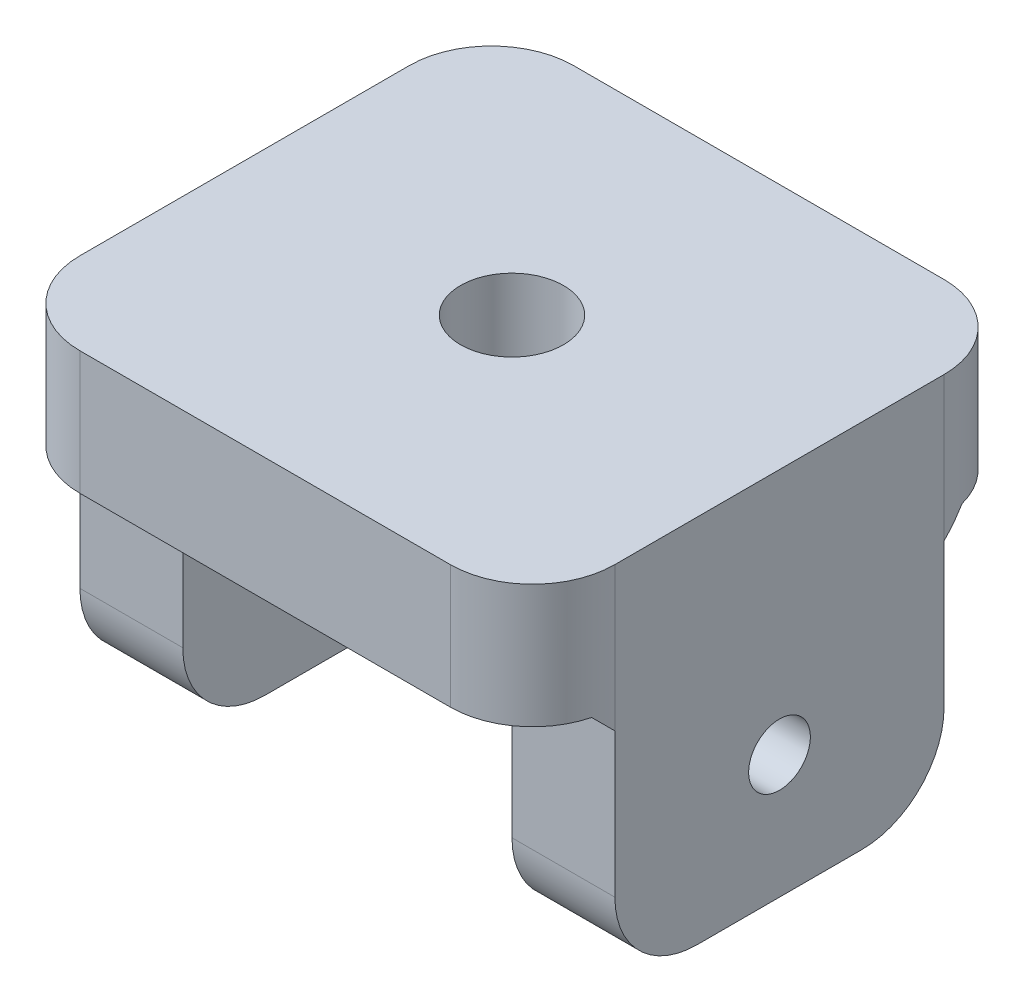
ISO-10303-21;
HEADER;
FILE_DESCRIPTION(('STEP AP214'),'2;1');
FILE_NAME('part.step','',(''),(''),'','','');
FILE_SCHEMA(('AUTOMOTIVE_DESIGN { 1 0 10303 214 1 1 1 1 }'));
ENDSEC;
DATA;
#1=APPLICATION_CONTEXT('core data for automotive mechanical design processes');
#2=APPLICATION_PROTOCOL_DEFINITION('international standard','automotive_design',2000,#1);
#3=PRODUCT_CONTEXT('',#1,'mechanical');
#4=PRODUCT('Part','Part','',(#3));
#5=PRODUCT_RELATED_PRODUCT_CATEGORY('part','',(#4));
#6=PRODUCT_DEFINITION_FORMATION('','',#4);
#7=PRODUCT_DEFINITION_CONTEXT('part definition',#1,'design');
#8=PRODUCT_DEFINITION('design','',#6,#7);
#9=PRODUCT_DEFINITION_SHAPE('','',#8);
#10=(LENGTH_UNIT() NAMED_UNIT(*) SI_UNIT(.MILLI.,.METRE.));
#11=(NAMED_UNIT(*) PLANE_ANGLE_UNIT() SI_UNIT($,.RADIAN.));
#12=(NAMED_UNIT(*) SI_UNIT($,.STERADIAN.) SOLID_ANGLE_UNIT());
#13=UNCERTAINTY_MEASURE_WITH_UNIT(LENGTH_MEASURE(1.E-05),#10,'distance_accuracy_value','');
#14=(GEOMETRIC_REPRESENTATION_CONTEXT(3) GLOBAL_UNCERTAINTY_ASSIGNED_CONTEXT((#13)) GLOBAL_UNIT_ASSIGNED_CONTEXT((#10,
#11,#12)) REPRESENTATION_CONTEXT('',''));
#15=CARTESIAN_POINT('',(0.,0.,0.));
#16=DIRECTION('',(0.,0.,1.));
#17=DIRECTION('',(1.,0.,0.));
#18=AXIS2_PLACEMENT_3D('',#15,#16,#17);
#19=CARTESIAN_POINT('',(0.,0.,0.));
#20=DIRECTION('',(0.,1.,0.));
#21=DIRECTION('',(0.,0.,1.));
#22=AXIS2_PLACEMENT_3D('',#19,#20,#21);
#23=PLANE('',#22);
#24=CARTESIAN_POINT('',(-4.,0.,-20.));
#25=DIRECTION('',(0.,1.,0.));
#26=DIRECTION('',(0.,0.,1.));
#27=AXIS2_PLACEMENT_3D('',#24,#25,#26);
#28=CIRCLE('',#27,4.);
#29=CARTESIAN_POINT('',(-4.,0.,-24.));
#30=VERTEX_POINT('',#29);
#31=CARTESIAN_POINT('',(-0.127016653792583,0.,-21.));
#32=VERTEX_POINT('',#31);
#33=EDGE_CURVE('E221',#30,#32,#28,.F.);
#34=ORIENTED_EDGE('',*,*,#33,.T.);
#35=DIRECTION('',(-1.,0.,0.));
#36=VECTOR('',#35,1.);
#37=CARTESIAN_POINT('',(-5.,0.,-21.));
#38=LINE('',#37,#36);
#39=CARTESIAN_POINT('',(-5.,0.,-21.));
#40=VERTEX_POINT('',#39);
#41=EDGE_CURVE('E290',#32,#40,#38,.T.);
#42=ORIENTED_EDGE('',*,*,#41,.T.);
#43=DIRECTION('',(0.,0.,-1.));
#44=VECTOR('',#43,1.);
#45=CARTESIAN_POINT('',(-5.,0.,-4.));
#46=LINE('',#45,#44);
#47=CARTESIAN_POINT('',(-5.,0.,-3.));
#48=VERTEX_POINT('',#47);
#49=EDGE_CURVE('E380',#48,#40,#46,.T.);
#50=ORIENTED_EDGE('',*,*,#49,.F.);
#51=DIRECTION('',(1.,0.,0.));
#52=VECTOR('',#51,1.);
#53=CARTESIAN_POINT('',(0.,0.,-3.));
#54=LINE('',#53,#52);
#55=CARTESIAN_POINT('',(-0.127016653792583,0.,-3.));
#56=VERTEX_POINT('',#55);
#57=EDGE_CURVE('E286',#48,#56,#54,.T.);
#58=ORIENTED_EDGE('',*,*,#57,.T.);
#59=CARTESIAN_POINT('',(-4.,0.,-4.));
#60=DIRECTION('',(0.,1.,0.));
#61=DIRECTION('',(0.,0.,1.));
#62=AXIS2_PLACEMENT_3D('',#59,#60,#61);
#63=CIRCLE('',#62,4.);
#64=CARTESIAN_POINT('',(-4.,0.,0.));
#65=VERTEX_POINT('',#64);
#66=EDGE_CURVE('E215',#56,#65,#63,.F.);
#67=ORIENTED_EDGE('',*,*,#66,.T.);
#68=DIRECTION('',(1.,0.,0.));
#69=VECTOR('',#68,1.);
#70=CARTESIAN_POINT('',(0.,0.,0.));
#71=LINE('',#70,#69);
#72=CARTESIAN_POINT('',(-22.,0.,0.));
#73=VERTEX_POINT('',#72);
#74=EDGE_CURVE('E326',#73,#65,#71,.T.);
#75=ORIENTED_EDGE('',*,*,#74,.F.);
#76=CARTESIAN_POINT('',(-22.,0.,-4.));
#77=DIRECTION('',(0.,1.,0.));
#78=DIRECTION('',(0.,0.,1.));
#79=AXIS2_PLACEMENT_3D('',#76,#77,#78);
#80=CIRCLE('',#79,4.);
#81=CARTESIAN_POINT('',(-25.8729833462074,0.,-2.99999999999999));
#82=VERTEX_POINT('',#81);
#83=EDGE_CURVE('E212',#73,#82,#80,.F.);
#84=ORIENTED_EDGE('',*,*,#83,.T.);
#85=DIRECTION('',(1.,0.,0.));
#86=VECTOR('',#85,1.);
#87=CARTESIAN_POINT('',(-21.,0.,-2.99999999999999));
#88=LINE('',#87,#86);
#89=CARTESIAN_POINT('',(-21.,0.,-2.99999999999999));
#90=VERTEX_POINT('',#89);
#91=EDGE_CURVE('E283',#82,#90,#88,.T.);
#92=ORIENTED_EDGE('',*,*,#91,.T.);
#93=DIRECTION('',(0.,0.,1.));
#94=VECTOR('',#93,1.);
#95=CARTESIAN_POINT('',(-21.,0.,-4.));
#96=LINE('',#95,#94);
#97=CARTESIAN_POINT('',(-21.,0.,-21.));
#98=VERTEX_POINT('',#97);
#99=EDGE_CURVE('E334',#98,#90,#96,.T.);
#100=ORIENTED_EDGE('',*,*,#99,.F.);
#101=DIRECTION('',(-1.,0.,0.));
#102=VECTOR('',#101,1.);
#103=CARTESIAN_POINT('',(-26.,0.,-21.));
#104=LINE('',#103,#102);
#105=CARTESIAN_POINT('',(-25.8729833462074,0.,-21.));
#106=VERTEX_POINT('',#105);
#107=EDGE_CURVE('E288',#98,#106,#104,.T.);
#108=ORIENTED_EDGE('',*,*,#107,.T.);
#109=CARTESIAN_POINT('',(-22.,0.,-20.));
#110=DIRECTION('',(0.,1.,0.));
#111=DIRECTION('',(0.,0.,1.));
#112=AXIS2_PLACEMENT_3D('',#109,#110,#111);
#113=CIRCLE('',#112,4.);
#114=CARTESIAN_POINT('',(-22.,0.,-24.));
#115=VERTEX_POINT('',#114);
#116=EDGE_CURVE('E224',#106,#115,#113,.F.);
#117=ORIENTED_EDGE('',*,*,#116,.T.);
#118=DIRECTION('',(-1.,0.,0.));
#119=VECTOR('',#118,1.);
#120=CARTESIAN_POINT('',(0.,0.,-24.));
#121=LINE('',#120,#119);
#122=EDGE_CURVE('E350',#30,#115,#121,.T.);
#123=ORIENTED_EDGE('',*,*,#122,.F.);
#124=EDGE_LOOP('',(#34,#42,#50,#58,#67,#75,#84,#92,#100,#108,#117,#123));
#125=FACE_BOUND('',#124,.T.);
#126=ADVANCED_FACE('F37',(#125),#23,.F.);
#127=CARTESIAN_POINT('',(0.,6.,0.));
#128=DIRECTION('',(-1.,0.,0.));
#129=DIRECTION('',(0.,0.,1.));
#130=AXIS2_PLACEMENT_3D('',#127,#128,#129);
#131=PLANE('',#130);
#132=CARTESIAN_POINT('',(0.,-6.,-12.));
#133=DIRECTION('',(-1.,0.,0.));
#134=DIRECTION('',(0.,0.,1.));
#135=AXIS2_PLACEMENT_3D('',#132,#133,#134);
#136=CIRCLE('',#135,1.5);
#137=CARTESIAN_POINT('',(0.,-6.,-10.5));
#138=VERTEX_POINT('',#137);
#139=EDGE_CURVE('E366',#138,#138,#136,.T.);
#140=ORIENTED_EDGE('',*,*,#139,.T.);
#141=EDGE_LOOP('',(#140));
#142=FACE_BOUND('',#141,.T.);
#143=DIRECTION('',(0.,1.,0.));
#144=VECTOR('',#143,1.);
#145=CARTESIAN_POINT('',(0.,-12.,-4.));
#146=LINE('',#145,#144);
#147=CARTESIAN_POINT('',(0.,-8.,-4.));
#148=VERTEX_POINT('',#147);
#149=CARTESIAN_POINT('',(0.,-1.00000000000001,-4.));
#150=VERTEX_POINT('',#149);
#151=EDGE_CURVE('E397',#148,#150,#146,.T.);
#152=ORIENTED_EDGE('',*,*,#151,.F.);
#153=CARTESIAN_POINT('',(0.,-8.,-8.));
#154=DIRECTION('',(-1.,0.,0.));
#155=DIRECTION('',(0.,0.,1.));
#156=AXIS2_PLACEMENT_3D('',#153,#154,#155);
#157=CIRCLE('',#156,4.);
#158=CARTESIAN_POINT('',(0.,-12.,-8.));
#159=VERTEX_POINT('',#158);
#160=EDGE_CURVE('E258',#148,#159,#157,.F.);
#161=ORIENTED_EDGE('',*,*,#160,.T.);
#162=DIRECTION('',(0.,0.,1.));
#163=VECTOR('',#162,1.);
#164=CARTESIAN_POINT('',(0.,-12.,-4.));
#165=LINE('',#164,#163);
#166=CARTESIAN_POINT('',(0.,-12.,-16.));
#167=VERTEX_POINT('',#166);
#168=EDGE_CURVE('E381',#167,#159,#165,.T.);
#169=ORIENTED_EDGE('',*,*,#168,.F.);
#170=CARTESIAN_POINT('',(0.,-8.,-16.));
#171=DIRECTION('',(-1.,0.,0.));
#172=DIRECTION('',(0.,0.,1.));
#173=AXIS2_PLACEMENT_3D('',#170,#171,#172);
#174=CIRCLE('',#173,4.);
#175=CARTESIAN_POINT('',(0.,-8.,-20.));
#176=VERTEX_POINT('',#175);
#177=EDGE_CURVE('E256',#167,#176,#174,.F.);
#178=ORIENTED_EDGE('',*,*,#177,.T.);
#179=DIRECTION('',(0.,1.,0.));
#180=VECTOR('',#179,1.);
#181=CARTESIAN_POINT('',(0.,-12.,-20.));
#182=LINE('',#181,#180);
#183=CARTESIAN_POINT('',(0.,-1.00000000000001,-20.));
#184=VERTEX_POINT('',#183);
#185=EDGE_CURVE('E387',#176,#184,#182,.T.);
#186=ORIENTED_EDGE('',*,*,#185,.T.);
#187=DIRECTION('',(0.,-1.,0.));
#188=VECTOR('',#187,1.);
#189=CARTESIAN_POINT('',(0.,6.,-20.));
#190=LINE('',#189,#188);
#191=CARTESIAN_POINT('',(0.,6.,-20.));
#192=VERTEX_POINT('',#191);
#193=EDGE_CURVE('E237',#184,#192,#190,.F.);
#194=ORIENTED_EDGE('',*,*,#193,.T.);
#195=DIRECTION('',(0.,0.,-1.));
#196=VECTOR('',#195,1.);
#197=CARTESIAN_POINT('',(0.,6.,0.));
#198=LINE('',#197,#196);
#199=CARTESIAN_POINT('',(0.,6.,-4.));
#200=VERTEX_POINT('',#199);
#201=EDGE_CURVE('E351',#200,#192,#198,.T.);
#202=ORIENTED_EDGE('',*,*,#201,.F.);
#203=DIRECTION('',(0.,-1.,0.));
#204=VECTOR('',#203,1.);
#205=CARTESIAN_POINT('',(0.,6.,-4.));
#206=LINE('',#205,#204);
#207=EDGE_CURVE('E54',#200,#150,#206,.T.);
#208=ORIENTED_EDGE('',*,*,#207,.T.);
#209=EDGE_LOOP('',(#152,#161,#169,#178,#186,#194,#202,#208));
#210=FACE_BOUND('',#209,.T.);
#211=ADVANCED_FACE('F468',(#142,#210),#131,.F.);
#212=CARTESIAN_POINT('',(0.,6.,-24.));
#213=DIRECTION('',(0.,0.,1.));
#214=DIRECTION('',(1.,0.,0.));
#215=AXIS2_PLACEMENT_3D('',#212,#213,#214);
#216=PLANE('',#215);
#217=ORIENTED_EDGE('',*,*,#122,.T.);
#218=DIRECTION('',(0.,-1.,0.));
#219=VECTOR('',#218,1.);
#220=CARTESIAN_POINT('',(-22.,6.,-24.));
#221=LINE('',#220,#219);
#222=CARTESIAN_POINT('',(-22.,6.,-24.));
#223=VERTEX_POINT('',#222);
#224=EDGE_CURVE('E229',#115,#223,#221,.F.);
#225=ORIENTED_EDGE('',*,*,#224,.T.);
#226=DIRECTION('',(-1.,0.,0.));
#227=VECTOR('',#226,1.);
#228=CARTESIAN_POINT('',(0.,6.,-24.));
#229=LINE('',#228,#227);
#230=CARTESIAN_POINT('',(-4.,6.,-24.));
#231=VERTEX_POINT('',#230);
#232=EDGE_CURVE('E190',#231,#223,#229,.T.);
#233=ORIENTED_EDGE('',*,*,#232,.F.);
#234=DIRECTION('',(0.,-1.,0.));
#235=VECTOR('',#234,1.);
#236=CARTESIAN_POINT('',(-4.,6.,-24.));
#237=LINE('',#236,#235);
#238=EDGE_CURVE('E226',#231,#30,#237,.T.);
#239=ORIENTED_EDGE('',*,*,#238,.T.);
#240=EDGE_LOOP('',(#217,#225,#233,#239));
#241=FACE_BOUND('',#240,.T.);
#242=ADVANCED_FACE('F422',(#241),#216,.F.);
#243=CARTESIAN_POINT('',(-26.,6.,0.));
#244=DIRECTION('',(1.,0.,0.));
#245=DIRECTION('',(0.,0.,-1.));
#246=AXIS2_PLACEMENT_3D('',#243,#244,#245);
#247=PLANE('',#246);
#248=CARTESIAN_POINT('',(-26.,-6.,-12.));
#249=DIRECTION('',(-1.,0.,0.));
#250=DIRECTION('',(0.,0.,1.));
#251=AXIS2_PLACEMENT_3D('',#248,#249,#250);
#252=CIRCLE('',#251,1.5);
#253=CARTESIAN_POINT('',(-26.,-6.,-10.5));
#254=VERTEX_POINT('',#253);
#255=EDGE_CURVE('E362',#254,#254,#252,.T.);
#256=ORIENTED_EDGE('',*,*,#255,.F.);
#257=EDGE_LOOP('',(#256));
#258=FACE_BOUND('',#257,.T.);
#259=DIRECTION('',(0.,1.,0.));
#260=VECTOR('',#259,1.);
#261=CARTESIAN_POINT('',(-26.,-12.,-20.));
#262=LINE('',#261,#260);
#263=CARTESIAN_POINT('',(-26.,-8.,-20.));
#264=VERTEX_POINT('',#263);
#265=CARTESIAN_POINT('',(-26.,-1.00000000000001,-20.));
#266=VERTEX_POINT('',#265);
#267=EDGE_CURVE('E343',#264,#266,#262,.T.);
#268=ORIENTED_EDGE('',*,*,#267,.F.);
#269=CARTESIAN_POINT('',(-26.,-8.,-16.));
#270=DIRECTION('',(1.,0.,0.));
#271=DIRECTION('',(0.,0.,-1.));
#272=AXIS2_PLACEMENT_3D('',#269,#270,#271);
#273=CIRCLE('',#272,4.);
#274=CARTESIAN_POINT('',(-26.,-12.,-16.));
#275=VERTEX_POINT('',#274);
#276=EDGE_CURVE('E276',#264,#275,#273,.F.);
#277=ORIENTED_EDGE('',*,*,#276,.T.);
#278=DIRECTION('',(0.,0.,-1.));
#279=VECTOR('',#278,1.);
#280=CARTESIAN_POINT('',(-26.,-12.,-4.));
#281=LINE('',#280,#279);
#282=CARTESIAN_POINT('',(-26.,-12.,-8.));
#283=VERTEX_POINT('',#282);
#284=EDGE_CURVE('E399',#283,#275,#281,.T.);
#285=ORIENTED_EDGE('',*,*,#284,.F.);
#286=CARTESIAN_POINT('',(-26.,-8.,-8.));
#287=DIRECTION('',(1.,0.,0.));
#288=DIRECTION('',(0.,0.,-1.));
#289=AXIS2_PLACEMENT_3D('',#286,#287,#288);
#290=CIRCLE('',#289,4.);
#291=CARTESIAN_POINT('',(-26.,-8.,-4.));
#292=VERTEX_POINT('',#291);
#293=EDGE_CURVE('E274',#283,#292,#290,.F.);
#294=ORIENTED_EDGE('',*,*,#293,.T.);
#295=DIRECTION('',(0.,1.,0.));
#296=VECTOR('',#295,1.);
#297=CARTESIAN_POINT('',(-26.,-12.,-4.));
#298=LINE('',#297,#296);
#299=CARTESIAN_POINT('',(-26.,-1.00000000000001,-4.));
#300=VERTEX_POINT('',#299);
#301=EDGE_CURVE('E340',#292,#300,#298,.T.);
#302=ORIENTED_EDGE('',*,*,#301,.T.);
#303=DIRECTION('',(0.,-1.,0.));
#304=VECTOR('',#303,1.);
#305=CARTESIAN_POINT('',(-26.,6.,-4.));
#306=LINE('',#305,#304);
#307=CARTESIAN_POINT('',(-26.,6.,-3.99999999999999));
#308=VERTEX_POINT('',#307);
#309=EDGE_CURVE('E203',#300,#308,#306,.F.);
#310=ORIENTED_EDGE('',*,*,#309,.T.);
#311=DIRECTION('',(0.,0.,1.));
#312=VECTOR('',#311,1.);
#313=CARTESIAN_POINT('',(-26.,6.,0.));
#314=LINE('',#313,#312);
#315=CARTESIAN_POINT('',(-26.,6.,-20.));
#316=VERTEX_POINT('',#315);
#317=EDGE_CURVE('E187',#316,#308,#314,.T.);
#318=ORIENTED_EDGE('',*,*,#317,.F.);
#319=DIRECTION('',(0.,-1.,0.));
#320=VECTOR('',#319,1.);
#321=CARTESIAN_POINT('',(-26.,6.,-20.));
#322=LINE('',#321,#320);
#323=EDGE_CURVE('E199',#316,#266,#322,.T.);
#324=ORIENTED_EDGE('',*,*,#323,.T.);
#325=EDGE_LOOP('',(#268,#277,#285,#294,#302,#310,#318,#324));
#326=FACE_BOUND('',#325,.T.);
#327=ADVANCED_FACE('F198',(#258,#326),#247,.F.);
#328=CARTESIAN_POINT('',(0.,6.,0.));
#329=DIRECTION('',(0.,0.,-1.));
#330=DIRECTION('',(-1.,0.,0.));
#331=AXIS2_PLACEMENT_3D('',#328,#329,#330);
#332=PLANE('',#331);
#333=ORIENTED_EDGE('',*,*,#74,.T.);
#334=DIRECTION('',(0.,-1.,0.));
#335=VECTOR('',#334,1.);
#336=CARTESIAN_POINT('',(-4.,6.,0.));
#337=LINE('',#336,#335);
#338=CARTESIAN_POINT('',(-4.,6.,0.));
#339=VERTEX_POINT('',#338);
#340=EDGE_CURVE('E242',#65,#339,#337,.F.);
#341=ORIENTED_EDGE('',*,*,#340,.T.);
#342=DIRECTION('',(1.,0.,0.));
#343=VECTOR('',#342,1.);
#344=CARTESIAN_POINT('',(0.,6.,0.));
#345=LINE('',#344,#343);
#346=CARTESIAN_POINT('',(-22.,6.,0.));
#347=VERTEX_POINT('',#346);
#348=EDGE_CURVE('E204',#347,#339,#345,.T.);
#349=ORIENTED_EDGE('',*,*,#348,.F.);
#350=DIRECTION('',(0.,-1.,0.));
#351=VECTOR('',#350,1.);
#352=CARTESIAN_POINT('',(-22.,6.,0.));
#353=LINE('',#352,#351);
#354=EDGE_CURVE('E239',#347,#73,#353,.T.);
#355=ORIENTED_EDGE('',*,*,#354,.T.);
#356=EDGE_LOOP('',(#333,#341,#349,#355));
#357=FACE_BOUND('',#356,.T.);
#358=ADVANCED_FACE('F466',(#357),#332,.F.);
#359=CARTESIAN_POINT('',(0.,6.,0.));
#360=DIRECTION('',(0.,1.,0.));
#361=DIRECTION('',(0.,0.,1.));
#362=AXIS2_PLACEMENT_3D('',#359,#360,#361);
#363=PLANE('',#362);
#364=CARTESIAN_POINT('',(-13.,6.,-12.));
#365=DIRECTION('',(0.,1.,0.));
#366=DIRECTION('',(0.,0.,1.));
#367=AXIS2_PLACEMENT_3D('',#364,#365,#366);
#368=CIRCLE('',#367,2.5);
#369=CARTESIAN_POINT('',(-13.,6.,-9.5));
#370=VERTEX_POINT('',#369);
#371=EDGE_CURVE('E374',#370,#370,#368,.T.);
#372=ORIENTED_EDGE('',*,*,#371,.F.);
#373=EDGE_LOOP('',(#372));
#374=FACE_BOUND('',#373,.T.);
#375=ORIENTED_EDGE('',*,*,#232,.T.);
#376=CARTESIAN_POINT('',(-22.,6.,-20.));
#377=DIRECTION('',(0.,1.,0.));
#378=DIRECTION('',(0.,0.,1.));
#379=AXIS2_PLACEMENT_3D('',#376,#377,#378);
#380=CIRCLE('',#379,4.);
#381=EDGE_CURVE('E184',#223,#316,#380,.T.);
#382=ORIENTED_EDGE('',*,*,#381,.T.);
#383=ORIENTED_EDGE('',*,*,#317,.T.);
#384=CARTESIAN_POINT('',(-22.,6.,-4.));
#385=DIRECTION('',(0.,1.,0.));
#386=DIRECTION('',(0.,0.,1.));
#387=AXIS2_PLACEMENT_3D('',#384,#385,#386);
#388=CIRCLE('',#387,4.);
#389=EDGE_CURVE('E231',#308,#347,#388,.T.);
#390=ORIENTED_EDGE('',*,*,#389,.T.);
#391=ORIENTED_EDGE('',*,*,#348,.T.);
#392=CARTESIAN_POINT('',(-4.,6.,-4.));
#393=DIRECTION('',(0.,1.,0.));
#394=DIRECTION('',(0.,0.,1.));
#395=AXIS2_PLACEMENT_3D('',#392,#393,#394);
#396=CIRCLE('',#395,4.);
#397=EDGE_CURVE('E233',#339,#200,#396,.T.);
#398=ORIENTED_EDGE('',*,*,#397,.T.);
#399=ORIENTED_EDGE('',*,*,#201,.T.);
#400=CARTESIAN_POINT('',(-4.,6.,-20.));
#401=DIRECTION('',(0.,1.,0.));
#402=DIRECTION('',(0.,0.,1.));
#403=AXIS2_PLACEMENT_3D('',#400,#401,#402);
#404=CIRCLE('',#403,4.);
#405=EDGE_CURVE('E194',#192,#231,#404,.T.);
#406=ORIENTED_EDGE('',*,*,#405,.T.);
#407=EDGE_LOOP('',(#375,#382,#383,#390,#391,#398,#399,#406));
#408=FACE_BOUND('',#407,.T.);
#409=ADVANCED_FACE('F186',(#374,#408),#363,.T.);
#410=CARTESIAN_POINT('',(-26.,-12.,-20.));
#411=DIRECTION('',(0.,0.,1.));
#412=DIRECTION('',(1.,0.,0.));
#413=AXIS2_PLACEMENT_3D('',#410,#411,#412);
#414=PLANE('',#413);
#415=ORIENTED_EDGE('',*,*,#267,.T.);
#416=DIRECTION('',(1.,0.,0.));
#417=VECTOR('',#416,1.);
#418=CARTESIAN_POINT('',(-21.,-1.00000000000001,-20.));
#419=LINE('',#418,#417);
#420=CARTESIAN_POINT('',(-21.,-1.00000000000001,-20.));
#421=VERTEX_POINT('',#420);
#422=EDGE_CURVE('E293',#266,#421,#419,.T.);
#423=ORIENTED_EDGE('',*,*,#422,.T.);
#424=DIRECTION('',(0.,1.,0.));
#425=VECTOR('',#424,1.);
#426=CARTESIAN_POINT('',(-21.,-12.,-20.));
#427=LINE('',#426,#425);
#428=CARTESIAN_POINT('',(-21.,-8.,-20.));
#429=VERTEX_POINT('',#428);
#430=EDGE_CURVE('E339',#429,#421,#427,.T.);
#431=ORIENTED_EDGE('',*,*,#430,.F.);
#432=DIRECTION('',(1.,0.,0.));
#433=VECTOR('',#432,1.);
#434=CARTESIAN_POINT('',(-26.,-8.,-20.));
#435=LINE('',#434,#433);
#436=EDGE_CURVE('E272',#429,#264,#435,.F.);
#437=ORIENTED_EDGE('',*,*,#436,.T.);
#438=EDGE_LOOP('',(#415,#423,#431,#437));
#439=FACE_BOUND('',#438,.T.);
#440=ADVANCED_FACE('F416',(#439),#414,.F.);
#441=CARTESIAN_POINT('',(-21.,-12.,-4.));
#442=DIRECTION('',(-1.,0.,0.));
#443=DIRECTION('',(0.,0.,1.));
#444=AXIS2_PLACEMENT_3D('',#441,#442,#443);
#445=PLANE('',#444);
#446=CARTESIAN_POINT('',(-21.,-6.,-12.));
#447=DIRECTION('',(-1.,0.,0.));
#448=DIRECTION('',(0.,0.,1.));
#449=AXIS2_PLACEMENT_3D('',#446,#447,#448);
#450=CIRCLE('',#449,1.5);
#451=CARTESIAN_POINT('',(-21.,-6.,-10.5));
#452=VERTEX_POINT('',#451);
#453=EDGE_CURVE('E361',#452,#452,#450,.T.);
#454=ORIENTED_EDGE('',*,*,#453,.T.);
#455=EDGE_LOOP('',(#454));
#456=FACE_BOUND('',#455,.T.);
#457=DIRECTION('',(0.,0.,1.));
#458=VECTOR('',#457,1.);
#459=CARTESIAN_POINT('',(-21.,-12.,-4.));
#460=LINE('',#459,#458);
#461=CARTESIAN_POINT('',(-21.,-12.,-16.));
#462=VERTEX_POINT('',#461);
#463=CARTESIAN_POINT('',(-21.,-12.,-8.));
#464=VERTEX_POINT('',#463);
#465=EDGE_CURVE('E345',#462,#464,#460,.T.);
#466=ORIENTED_EDGE('',*,*,#465,.F.);
#467=CARTESIAN_POINT('',(-21.,-8.,-16.));
#468=DIRECTION('',(-1.,0.,0.));
#469=DIRECTION('',(0.,0.,1.));
#470=AXIS2_PLACEMENT_3D('',#467,#468,#469);
#471=CIRCLE('',#470,4.);
#472=EDGE_CURVE('E270',#462,#429,#471,.F.);
#473=ORIENTED_EDGE('',*,*,#472,.T.);
#474=ORIENTED_EDGE('',*,*,#430,.T.);
#475=DIRECTION('',(0.,-0.70710678118655,0.707106781186545));
#476=VECTOR('',#475,1.);
#477=CARTESIAN_POINT('',(-21.,-14.5,-6.50000000000006));
#478=LINE('',#477,#476);
#479=EDGE_CURVE('E306',#421,#98,#478,.F.);
#480=ORIENTED_EDGE('',*,*,#479,.T.);
#481=ORIENTED_EDGE('',*,*,#99,.T.);
#482=DIRECTION('',(0.,0.70710678118655,0.707106781186545));
#483=VECTOR('',#482,1.);
#484=CARTESIAN_POINT('',(-21.,-6.50000000000004,-9.49999999999999));
#485=LINE('',#484,#483);
#486=CARTESIAN_POINT('',(-21.,-1.00000000000001,-4.));
#487=VERTEX_POINT('',#486);
#488=EDGE_CURVE('E11',#90,#487,#485,.F.);
#489=ORIENTED_EDGE('',*,*,#488,.T.);
#490=DIRECTION('',(0.,1.,0.));
#491=VECTOR('',#490,1.);
#492=CARTESIAN_POINT('',(-21.,-12.,-4.));
#493=LINE('',#492,#491);
#494=CARTESIAN_POINT('',(-21.,-8.,-4.));
#495=VERTEX_POINT('',#494);
#496=EDGE_CURVE('E332',#495,#487,#493,.T.);
#497=ORIENTED_EDGE('',*,*,#496,.F.);
#498=CARTESIAN_POINT('',(-21.,-8.,-7.99999999999999));
#499=DIRECTION('',(-1.,0.,0.));
#500=DIRECTION('',(0.,0.,1.));
#501=AXIS2_PLACEMENT_3D('',#498,#499,#500);
#502=CIRCLE('',#501,4.);
#503=EDGE_CURVE('E268',#495,#464,#502,.F.);
#504=ORIENTED_EDGE('',*,*,#503,.T.);
#505=EDGE_LOOP('',(#466,#473,#474,#480,#481,#489,#497,#504));
#506=FACE_BOUND('',#505,.T.);
#507=ADVANCED_FACE('F331',(#456,#506),#445,.F.);
#508=CARTESIAN_POINT('',(-26.,-12.,-4.));
#509=DIRECTION('',(0.,0.,-1.));
#510=DIRECTION('',(-1.,0.,0.));
#511=AXIS2_PLACEMENT_3D('',#508,#509,#510);
#512=PLANE('',#511);
#513=ORIENTED_EDGE('',*,*,#496,.T.);
#514=DIRECTION('',(-1.,0.,0.));
#515=VECTOR('',#514,1.);
#516=CARTESIAN_POINT('',(-26.,-1.00000000000001,-4.));
#517=LINE('',#516,#515);
#518=EDGE_CURVE('E299',#487,#300,#517,.T.);
#519=ORIENTED_EDGE('',*,*,#518,.T.);
#520=ORIENTED_EDGE('',*,*,#301,.F.);
#521=DIRECTION('',(-1.,0.,0.));
#522=VECTOR('',#521,1.);
#523=CARTESIAN_POINT('',(-21.,-8.,-4.));
#524=LINE('',#523,#522);
#525=EDGE_CURVE('E278',#292,#495,#524,.F.);
#526=ORIENTED_EDGE('',*,*,#525,.T.);
#527=EDGE_LOOP('',(#513,#519,#520,#526));
#528=FACE_BOUND('',#527,.T.);
#529=ADVANCED_FACE('F336',(#528),#512,.F.);
#530=CARTESIAN_POINT('',(0.,-12.,0.));
#531=DIRECTION('',(0.,-1.,0.));
#532=DIRECTION('',(0.,0.,-1.));
#533=AXIS2_PLACEMENT_3D('',#530,#531,#532);
#534=PLANE('',#533);
#535=ORIENTED_EDGE('',*,*,#284,.T.);
#536=DIRECTION('',(1.,0.,0.));
#537=VECTOR('',#536,1.);
#538=CARTESIAN_POINT('',(-21.,-12.,-16.));
#539=LINE('',#538,#537);
#540=EDGE_CURVE('E265',#275,#462,#539,.T.);
#541=ORIENTED_EDGE('',*,*,#540,.T.);
#542=ORIENTED_EDGE('',*,*,#465,.T.);
#543=DIRECTION('',(-1.,0.,0.));
#544=VECTOR('',#543,1.);
#545=CARTESIAN_POINT('',(-26.,-12.,-8.));
#546=LINE('',#545,#544);
#547=EDGE_CURVE('E262',#464,#283,#546,.T.);
#548=ORIENTED_EDGE('',*,*,#547,.T.);
#549=EDGE_LOOP('',(#535,#541,#542,#548));
#550=FACE_BOUND('',#549,.T.);
#551=ADVANCED_FACE('F405',(#550),#534,.T.);
#552=CARTESIAN_POINT('',(0.,-12.,-4.));
#553=DIRECTION('',(0.,0.,-1.));
#554=DIRECTION('',(-1.,0.,0.));
#555=AXIS2_PLACEMENT_3D('',#552,#553,#554);
#556=PLANE('',#555);
#557=ORIENTED_EDGE('',*,*,#151,.T.);
#558=DIRECTION('',(-1.,0.,0.));
#559=VECTOR('',#558,1.);
#560=CARTESIAN_POINT('',(-5.,-1.00000000000001,-4.));
#561=LINE('',#560,#559);
#562=CARTESIAN_POINT('',(-5.,-1.00000000000001,-4.));
#563=VERTEX_POINT('',#562);
#564=EDGE_CURVE('E296',#150,#563,#561,.T.);
#565=ORIENTED_EDGE('',*,*,#564,.T.);
#566=DIRECTION('',(0.,1.,0.));
#567=VECTOR('',#566,1.);
#568=CARTESIAN_POINT('',(-5.,-12.,-4.));
#569=LINE('',#568,#567);
#570=CARTESIAN_POINT('',(-5.,-8.,-4.));
#571=VERTEX_POINT('',#570);
#572=EDGE_CURVE('E394',#571,#563,#569,.T.);
#573=ORIENTED_EDGE('',*,*,#572,.F.);
#574=DIRECTION('',(-1.,0.,0.));
#575=VECTOR('',#574,1.);
#576=CARTESIAN_POINT('',(0.,-8.,-4.));
#577=LINE('',#576,#575);
#578=EDGE_CURVE('E254',#571,#148,#577,.F.);
#579=ORIENTED_EDGE('',*,*,#578,.T.);
#580=EDGE_LOOP('',(#557,#565,#573,#579));
#581=FACE_BOUND('',#580,.T.);
#582=ADVANCED_FACE('F453',(#581),#556,.F.);
#583=CARTESIAN_POINT('',(-5.,-12.,-4.));
#584=DIRECTION('',(1.,0.,0.));
#585=DIRECTION('',(0.,0.,-1.));
#586=AXIS2_PLACEMENT_3D('',#583,#584,#585);
#587=PLANE('',#586);
#588=CARTESIAN_POINT('',(-5.,-6.,-12.));
#589=DIRECTION('',(1.,0.,0.));
#590=DIRECTION('',(0.,0.,-1.));
#591=AXIS2_PLACEMENT_3D('',#588,#589,#590);
#592=CIRCLE('',#591,1.5);
#593=CARTESIAN_POINT('',(-5.,-6.,-13.5));
#594=VERTEX_POINT('',#593);
#595=EDGE_CURVE('E359',#594,#594,#592,.T.);
#596=ORIENTED_EDGE('',*,*,#595,.T.);
#597=EDGE_LOOP('',(#596));
#598=FACE_BOUND('',#597,.T.);
#599=DIRECTION('',(0.,0.,-1.));
#600=VECTOR('',#599,1.);
#601=CARTESIAN_POINT('',(-5.,-12.,-4.));
#602=LINE('',#601,#600);
#603=CARTESIAN_POINT('',(-5.,-12.,-8.));
#604=VERTEX_POINT('',#603);
#605=CARTESIAN_POINT('',(-5.,-12.,-16.));
#606=VERTEX_POINT('',#605);
#607=EDGE_CURVE('E384',#604,#606,#602,.T.);
#608=ORIENTED_EDGE('',*,*,#607,.F.);
#609=CARTESIAN_POINT('',(-5.,-8.,-8.));
#610=DIRECTION('',(1.,0.,0.));
#611=DIRECTION('',(0.,0.,-1.));
#612=AXIS2_PLACEMENT_3D('',#609,#610,#611);
#613=CIRCLE('',#612,4.);
#614=EDGE_CURVE('E252',#604,#571,#613,.F.);
#615=ORIENTED_EDGE('',*,*,#614,.T.);
#616=ORIENTED_EDGE('',*,*,#572,.T.);
#617=DIRECTION('',(0.,-0.707106781186551,-0.707106781186544));
#618=VECTOR('',#617,1.);
#619=CARTESIAN_POINT('',(-5.,-6.50000000000006,-9.49999999999999));
#620=LINE('',#619,#618);
#621=EDGE_CURVE('E310',#563,#48,#620,.F.);
#622=ORIENTED_EDGE('',*,*,#621,.T.);
#623=ORIENTED_EDGE('',*,*,#49,.T.);
#624=DIRECTION('',(0.,0.70710678118655,-0.707106781186545));
#625=VECTOR('',#624,1.);
#626=CARTESIAN_POINT('',(-5.,-14.5,-6.50000000000006));
#627=LINE('',#626,#625);
#628=CARTESIAN_POINT('',(-5.,-1.00000000000001,-20.));
#629=VERTEX_POINT('',#628);
#630=EDGE_CURVE('E304',#40,#629,#627,.F.);
#631=ORIENTED_EDGE('',*,*,#630,.T.);
#632=DIRECTION('',(0.,1.,0.));
#633=VECTOR('',#632,1.);
#634=CARTESIAN_POINT('',(-5.,-12.,-20.));
#635=LINE('',#634,#633);
#636=CARTESIAN_POINT('',(-5.,-8.,-20.));
#637=VERTEX_POINT('',#636);
#638=EDGE_CURVE('E391',#637,#629,#635,.T.);
#639=ORIENTED_EDGE('',*,*,#638,.F.);
#640=CARTESIAN_POINT('',(-5.,-8.,-16.));
#641=DIRECTION('',(1.,0.,0.));
#642=DIRECTION('',(0.,0.,-1.));
#643=AXIS2_PLACEMENT_3D('',#640,#641,#642);
#644=CIRCLE('',#643,4.);
#645=EDGE_CURVE('E250',#637,#606,#644,.F.);
#646=ORIENTED_EDGE('',*,*,#645,.T.);
#647=EDGE_LOOP('',(#608,#615,#616,#622,#623,#631,#639,#646));
#648=FACE_BOUND('',#647,.T.);
#649=ADVANCED_FACE('F434',(#598,#648),#587,.F.);
#650=CARTESIAN_POINT('',(0.,-12.,-20.));
#651=DIRECTION('',(0.,0.,1.));
#652=DIRECTION('',(1.,0.,0.));
#653=AXIS2_PLACEMENT_3D('',#650,#651,#652);
#654=PLANE('',#653);
#655=ORIENTED_EDGE('',*,*,#638,.T.);
#656=DIRECTION('',(1.,0.,0.));
#657=VECTOR('',#656,1.);
#658=CARTESIAN_POINT('',(0.,-1.00000000000001,-20.));
#659=LINE('',#658,#657);
#660=EDGE_CURVE('E280',#629,#184,#659,.T.);
#661=ORIENTED_EDGE('',*,*,#660,.T.);
#662=ORIENTED_EDGE('',*,*,#185,.F.);
#663=DIRECTION('',(1.,0.,0.));
#664=VECTOR('',#663,1.);
#665=CARTESIAN_POINT('',(0.,-8.,-20.));
#666=LINE('',#665,#664);
#667=EDGE_CURVE('E260',#176,#637,#666,.F.);
#668=ORIENTED_EDGE('',*,*,#667,.T.);
#669=EDGE_LOOP('',(#655,#661,#662,#668));
#670=FACE_BOUND('',#669,.T.);
#671=ADVANCED_FACE('F437',(#670),#654,.F.);
#672=CARTESIAN_POINT('',(0.,-12.,0.));
#673=DIRECTION('',(0.,1.,0.));
#674=DIRECTION('',(0.,0.,1.));
#675=AXIS2_PLACEMENT_3D('',#672,#673,#674);
#676=PLANE('',#675);
#677=ORIENTED_EDGE('',*,*,#168,.T.);
#678=DIRECTION('',(-1.,0.,0.));
#679=VECTOR('',#678,1.);
#680=CARTESIAN_POINT('',(0.,-12.,-8.));
#681=LINE('',#680,#679);
#682=EDGE_CURVE('E247',#159,#604,#681,.T.);
#683=ORIENTED_EDGE('',*,*,#682,.T.);
#684=ORIENTED_EDGE('',*,*,#607,.T.);
#685=DIRECTION('',(1.,0.,0.));
#686=VECTOR('',#685,1.);
#687=CARTESIAN_POINT('',(0.,-12.,-16.));
#688=LINE('',#687,#686);
#689=EDGE_CURVE('E244',#606,#167,#688,.T.);
#690=ORIENTED_EDGE('',*,*,#689,.T.);
#691=EDGE_LOOP('',(#677,#683,#684,#690));
#692=FACE_BOUND('',#691,.T.);
#693=ADVANCED_FACE('F444',(#692),#676,.F.);
#694=CARTESIAN_POINT('',(54.,-6.,-12.));
#695=DIRECTION('',(-1.,0.,0.));
#696=DIRECTION('',(0.,0.,1.));
#697=AXIS2_PLACEMENT_3D('',#694,#695,#696);
#698=CYLINDRICAL_SURFACE('',#697,1.5);
#699=ORIENTED_EDGE('',*,*,#595,.F.);
#700=EDGE_LOOP('',(#699));
#701=FACE_BOUND('',#700,.T.);
#702=ORIENTED_EDGE('',*,*,#139,.F.);
#703=EDGE_LOOP('',(#702));
#704=FACE_BOUND('',#703,.T.);
#705=ADVANCED_FACE('F563',(#701,#704),#698,.F.);
#706=ORIENTED_EDGE('',*,*,#255,.T.);
#707=EDGE_LOOP('',(#706));
#708=FACE_BOUND('',#707,.T.);
#709=ORIENTED_EDGE('',*,*,#453,.F.);
#710=EDGE_LOOP('',(#709));
#711=FACE_BOUND('',#710,.T.);
#712=ADVANCED_FACE('F571',(#708,#711),#698,.F.);
#713=CARTESIAN_POINT('',(-13.,2.25,-12.));
#714=DIRECTION('',(0.,1.,0.));
#715=DIRECTION('',(0.,0.,1.));
#716=AXIS2_PLACEMENT_3D('',#713,#714,#715);
#717=CYLINDRICAL_SURFACE('',#716,2.5);
#718=CARTESIAN_POINT('',(-13.,2.25,-12.));
#719=DIRECTION('',(0.,1.,0.));
#720=DIRECTION('',(0.,0.,1.));
#721=AXIS2_PLACEMENT_3D('',#718,#719,#720);
#722=CIRCLE('',#721,2.5);
#723=CARTESIAN_POINT('',(-13.,2.25,-9.5));
#724=VERTEX_POINT('',#723);
#725=EDGE_CURVE('E369',#724,#724,#722,.T.);
#726=ORIENTED_EDGE('',*,*,#725,.F.);
#727=EDGE_LOOP('',(#726));
#728=FACE_BOUND('',#727,.T.);
#729=ORIENTED_EDGE('',*,*,#371,.T.);
#730=EDGE_LOOP('',(#729));
#731=FACE_BOUND('',#730,.T.);
#732=ADVANCED_FACE('F579',(#728,#731),#717,.F.);
#733=CARTESIAN_POINT('',(-13.,2.25,-12.));
#734=DIRECTION('',(0.,1.,0.));
#735=DIRECTION('',(0.,0.,1.));
#736=AXIS2_PLACEMENT_3D('',#733,#734,#735);
#737=PLANE('',#736);
#738=ORIENTED_EDGE('',*,*,#725,.T.);
#739=EDGE_LOOP('',(#738));
#740=FACE_BOUND('',#739,.T.);
#741=ADVANCED_FACE('F477',(#740),#737,.T.);
#742=CARTESIAN_POINT('',(-22.,6.,-20.));
#743=DIRECTION('',(0.,-1.,0.));
#744=DIRECTION('',(0.,0.,-1.));
#745=AXIS2_PLACEMENT_3D('',#742,#743,#744);
#746=CYLINDRICAL_SURFACE('',#745,4.);
#747=ORIENTED_EDGE('',*,*,#381,.F.);
#748=ORIENTED_EDGE('',*,*,#224,.F.);
#749=ORIENTED_EDGE('',*,*,#116,.F.);
#750=CARTESIAN_POINT('',(-22.,-1.00000000000001,-20.));
#751=DIRECTION('',(0.,-0.707106781186545,-0.70710678118655));
#752=DIRECTION('',(0.,-0.70710678118655,0.707106781186545));
#753=AXIS2_PLACEMENT_3D('',#750,#751,#752);
#754=ELLIPSE('',#753,5.6568542494924,4.);
#755=EDGE_CURVE('E210',#106,#266,#754,.F.);
#756=ORIENTED_EDGE('',*,*,#755,.T.);
#757=ORIENTED_EDGE('',*,*,#323,.F.);
#758=EDGE_LOOP('',(#747,#748,#749,#756,#757));
#759=FACE_BOUND('',#758,.T.);
#760=ADVANCED_FACE('F207',(#759),#746,.T.);
#761=CARTESIAN_POINT('',(-4.,6.,-20.));
#762=DIRECTION('',(0.,-1.,0.));
#763=DIRECTION('',(0.,0.,-1.));
#764=AXIS2_PLACEMENT_3D('',#761,#762,#763);
#765=CYLINDRICAL_SURFACE('',#764,4.);
#766=ORIENTED_EDGE('',*,*,#405,.F.);
#767=ORIENTED_EDGE('',*,*,#193,.F.);
#768=CARTESIAN_POINT('',(-4.,-1.,-20.));
#769=DIRECTION('',(0.,-0.707106781186545,-0.70710678118655));
#770=DIRECTION('',(0.,-0.70710678118655,0.707106781186545));
#771=AXIS2_PLACEMENT_3D('',#768,#769,#770);
#772=ELLIPSE('',#771,5.6568542494924,4.);
#773=EDGE_CURVE('E302',#184,#32,#772,.F.);
#774=ORIENTED_EDGE('',*,*,#773,.T.);
#775=ORIENTED_EDGE('',*,*,#33,.F.);
#776=ORIENTED_EDGE('',*,*,#238,.F.);
#777=EDGE_LOOP('',(#766,#767,#774,#775,#776));
#778=FACE_BOUND('',#777,.T.);
#779=ADVANCED_FACE('F469',(#778),#765,.T.);
#780=CARTESIAN_POINT('',(-4.,6.,-4.));
#781=DIRECTION('',(0.,-1.,0.));
#782=DIRECTION('',(0.,0.,-1.));
#783=AXIS2_PLACEMENT_3D('',#780,#781,#782);
#784=CYLINDRICAL_SURFACE('',#783,4.);
#785=ORIENTED_EDGE('',*,*,#397,.F.);
#786=ORIENTED_EDGE('',*,*,#340,.F.);
#787=ORIENTED_EDGE('',*,*,#66,.F.);
#788=CARTESIAN_POINT('',(-4.,-1.00000000000001,-4.));
#789=DIRECTION('',(0.,-0.707106781186544,0.707106781186551));
#790=DIRECTION('',(0.,-0.707106781186551,-0.707106781186544));
#791=AXIS2_PLACEMENT_3D('',#788,#789,#790);
#792=ELLIPSE('',#791,5.65685424949241,4.);
#793=EDGE_CURVE('E313',#56,#150,#792,.F.);
#794=ORIENTED_EDGE('',*,*,#793,.T.);
#795=ORIENTED_EDGE('',*,*,#207,.F.);
#796=EDGE_LOOP('',(#785,#786,#787,#794,#795));
#797=FACE_BOUND('',#796,.T.);
#798=ADVANCED_FACE('F463',(#797),#784,.T.);
#799=CARTESIAN_POINT('',(-22.,6.,-4.));
#800=DIRECTION('',(0.,-1.,0.));
#801=DIRECTION('',(0.,0.,-1.));
#802=AXIS2_PLACEMENT_3D('',#799,#800,#801);
#803=CYLINDRICAL_SURFACE('',#802,4.);
#804=ORIENTED_EDGE('',*,*,#389,.F.);
#805=ORIENTED_EDGE('',*,*,#309,.F.);
#806=CARTESIAN_POINT('',(-22.,-1.00000000000001,-4.));
#807=DIRECTION('',(0.,-0.707106781186545,0.70710678118655));
#808=DIRECTION('',(0.,-0.70710678118655,-0.707106781186545));
#809=AXIS2_PLACEMENT_3D('',#806,#807,#808);
#810=ELLIPSE('',#809,5.6568542494924,4.);
#811=EDGE_CURVE('E47',#300,#82,#810,.F.);
#812=ORIENTED_EDGE('',*,*,#811,.T.);
#813=ORIENTED_EDGE('',*,*,#83,.F.);
#814=ORIENTED_EDGE('',*,*,#354,.F.);
#815=EDGE_LOOP('',(#804,#805,#812,#813,#814));
#816=FACE_BOUND('',#815,.T.);
#817=ADVANCED_FACE('F317',(#816),#803,.T.);
#818=CARTESIAN_POINT('',(0.,-8.,-8.));
#819=DIRECTION('',(-1.,0.,0.));
#820=DIRECTION('',(0.,0.,1.));
#821=AXIS2_PLACEMENT_3D('',#818,#819,#820);
#822=CYLINDRICAL_SURFACE('',#821,4.);
#823=ORIENTED_EDGE('',*,*,#160,.F.);
#824=ORIENTED_EDGE('',*,*,#578,.F.);
#825=ORIENTED_EDGE('',*,*,#614,.F.);
#826=ORIENTED_EDGE('',*,*,#682,.F.);
#827=EDGE_LOOP('',(#823,#824,#825,#826));
#828=FACE_BOUND('',#827,.T.);
#829=ADVANCED_FACE('F449',(#828),#822,.T.);
#830=CARTESIAN_POINT('',(0.,-8.,-16.));
#831=DIRECTION('',(1.,0.,0.));
#832=DIRECTION('',(0.,0.,-1.));
#833=AXIS2_PLACEMENT_3D('',#830,#831,#832);
#834=CYLINDRICAL_SURFACE('',#833,4.);
#835=ORIENTED_EDGE('',*,*,#645,.F.);
#836=ORIENTED_EDGE('',*,*,#667,.F.);
#837=ORIENTED_EDGE('',*,*,#177,.F.);
#838=ORIENTED_EDGE('',*,*,#689,.F.);
#839=EDGE_LOOP('',(#835,#836,#837,#838));
#840=FACE_BOUND('',#839,.T.);
#841=ADVANCED_FACE('F441',(#840),#834,.T.);
#842=CARTESIAN_POINT('',(0.,-8.,-16.));
#843=DIRECTION('',(-1.,0.,0.));
#844=DIRECTION('',(0.,0.,1.));
#845=AXIS2_PLACEMENT_3D('',#842,#843,#844);
#846=CYLINDRICAL_SURFACE('',#845,4.);
#847=ORIENTED_EDGE('',*,*,#276,.F.);
#848=ORIENTED_EDGE('',*,*,#436,.F.);
#849=ORIENTED_EDGE('',*,*,#472,.F.);
#850=ORIENTED_EDGE('',*,*,#540,.F.);
#851=EDGE_LOOP('',(#847,#848,#849,#850));
#852=FACE_BOUND('',#851,.T.);
#853=ADVANCED_FACE('F412',(#852),#846,.T.);
#854=CARTESIAN_POINT('',(0.,-8.,-7.99999999999999));
#855=DIRECTION('',(1.,0.,0.));
#856=DIRECTION('',(0.,0.,-1.));
#857=AXIS2_PLACEMENT_3D('',#854,#855,#856);
#858=CYLINDRICAL_SURFACE('',#857,4.);
#859=ORIENTED_EDGE('',*,*,#503,.F.);
#860=ORIENTED_EDGE('',*,*,#525,.F.);
#861=ORIENTED_EDGE('',*,*,#293,.F.);
#862=ORIENTED_EDGE('',*,*,#547,.F.);
#863=EDGE_LOOP('',(#859,#860,#861,#862));
#864=FACE_BOUND('',#863,.T.);
#865=ADVANCED_FACE('F409',(#864),#858,.T.);
#866=CARTESIAN_POINT('',(0.,-1.00000000000001,-20.));
#867=DIRECTION('',(0.,-0.707106781186545,-0.70710678118655));
#868=DIRECTION('',(-1.,0.,0.));
#869=AXIS2_PLACEMENT_3D('',#866,#867,#868);
#870=PLANE('',#869);
#871=ORIENTED_EDGE('',*,*,#630,.F.);
#872=ORIENTED_EDGE('',*,*,#41,.F.);
#873=ORIENTED_EDGE('',*,*,#773,.F.);
#874=ORIENTED_EDGE('',*,*,#660,.F.);
#875=EDGE_LOOP('',(#871,#872,#873,#874));
#876=FACE_BOUND('',#875,.T.);
#877=ADVANCED_FACE('F429',(#876),#870,.T.);
#878=CARTESIAN_POINT('',(-26.,-1.00000000000001,-20.));
#879=DIRECTION('',(0.,-0.707106781186545,-0.70710678118655));
#880=DIRECTION('',(-1.,0.,0.));
#881=AXIS2_PLACEMENT_3D('',#878,#879,#880);
#882=PLANE('',#881);
#883=ORIENTED_EDGE('',*,*,#755,.F.);
#884=ORIENTED_EDGE('',*,*,#107,.F.);
#885=ORIENTED_EDGE('',*,*,#479,.F.);
#886=ORIENTED_EDGE('',*,*,#422,.F.);
#887=EDGE_LOOP('',(#883,#884,#885,#886));
#888=FACE_BOUND('',#887,.T.);
#889=ADVANCED_FACE('F418',(#888),#882,.T.);
#890=CARTESIAN_POINT('',(0.,-1.00000000000001,-4.));
#891=DIRECTION('',(0.,-0.707106781186544,0.707106781186551));
#892=DIRECTION('',(1.,0.,0.));
#893=AXIS2_PLACEMENT_3D('',#890,#891,#892);
#894=PLANE('',#893);
#895=ORIENTED_EDGE('',*,*,#793,.F.);
#896=ORIENTED_EDGE('',*,*,#57,.F.);
#897=ORIENTED_EDGE('',*,*,#621,.F.);
#898=ORIENTED_EDGE('',*,*,#564,.F.);
#899=EDGE_LOOP('',(#895,#896,#897,#898));
#900=FACE_BOUND('',#899,.T.);
#901=ADVANCED_FACE('F457',(#900),#894,.T.);
#902=CARTESIAN_POINT('',(-26.,-1.00000000000001,-4.));
#903=DIRECTION('',(0.,-0.707106781186545,0.70710678118655));
#904=DIRECTION('',(1.,0.,0.));
#905=AXIS2_PLACEMENT_3D('',#902,#903,#904);
#906=PLANE('',#905);
#907=ORIENTED_EDGE('',*,*,#488,.F.);
#908=ORIENTED_EDGE('',*,*,#91,.F.);
#909=ORIENTED_EDGE('',*,*,#811,.F.);
#910=ORIENTED_EDGE('',*,*,#518,.F.);
#911=EDGE_LOOP('',(#907,#908,#909,#910));
#912=FACE_BOUND('',#911,.T.);
#913=ADVANCED_FACE('F40',(#912),#906,.T.);
#914=CLOSED_SHELL('',(#126,#211,#242,#327,#358,#409,#440,#507,#529,#551,#582,#649,#671,#693,
#705,#712,#732,#741,#760,#779,#798,#817,#829,#841,#853,#865,#877,#889,#901,#913));
#915=MANIFOLD_SOLID_BREP('B2',#914);
#916=ADVANCED_BREP_SHAPE_REPRESENTATION('',(#18,#915),#14);
#917=SHAPE_DEFINITION_REPRESENTATION(#9,#916);
ENDSEC;
END-ISO-10303-21;
